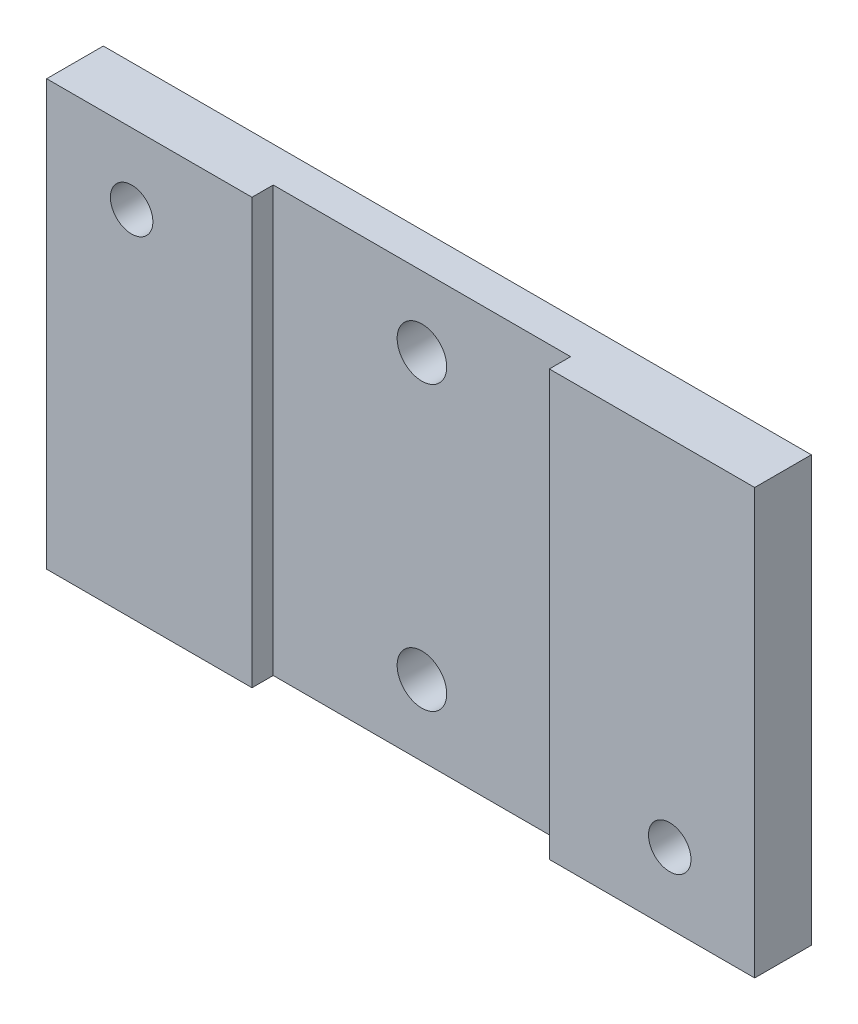
ISO-10303-21;
HEADER;
FILE_DESCRIPTION(('STEP AP214'),'2;1');
FILE_NAME('part.step','',(''),(''),'','','');
FILE_SCHEMA(('AUTOMOTIVE_DESIGN { 1 0 10303 214 1 1 1 1 }'));
ENDSEC;
DATA;
#1=APPLICATION_CONTEXT('core data for automotive mechanical design processes');
#2=APPLICATION_PROTOCOL_DEFINITION('international standard','automotive_design',2000,#1);
#3=PRODUCT_CONTEXT('',#1,'mechanical');
#4=PRODUCT('Part','Part','',(#3));
#5=PRODUCT_RELATED_PRODUCT_CATEGORY('part','',(#4));
#6=PRODUCT_DEFINITION_FORMATION('','',#4);
#7=PRODUCT_DEFINITION_CONTEXT('part definition',#1,'design');
#8=PRODUCT_DEFINITION('design','',#6,#7);
#9=PRODUCT_DEFINITION_SHAPE('','',#8);
#10=(LENGTH_UNIT() NAMED_UNIT(*) SI_UNIT(.MILLI.,.METRE.));
#11=(NAMED_UNIT(*) PLANE_ANGLE_UNIT() SI_UNIT($,.RADIAN.));
#12=(NAMED_UNIT(*) SI_UNIT($,.STERADIAN.) SOLID_ANGLE_UNIT());
#13=UNCERTAINTY_MEASURE_WITH_UNIT(LENGTH_MEASURE(1.E-05),#10,'distance_accuracy_value','');
#14=(GEOMETRIC_REPRESENTATION_CONTEXT(3) GLOBAL_UNCERTAINTY_ASSIGNED_CONTEXT((#13)) GLOBAL_UNIT_ASSIGNED_CONTEXT((#10,
#11,#12)) REPRESENTATION_CONTEXT('',''));
#15=CARTESIAN_POINT('',(0.,0.,0.));
#16=DIRECTION('',(0.,0.,1.));
#17=DIRECTION('',(1.,0.,0.));
#18=AXIS2_PLACEMENT_3D('',#15,#16,#17);
#19=CARTESIAN_POINT('',(0.,0.,4.));
#20=DIRECTION('',(0.,0.,-1.));
#21=DIRECTION('',(-1.,0.,0.));
#22=AXIS2_PLACEMENT_3D('',#19,#20,#21);
#23=PLANE('',#22);
#24=CARTESIAN_POINT('',(6.,25.,4.));
#25=DIRECTION('',(0.,0.,1.));
#26=DIRECTION('',(1.,0.,0.));
#27=AXIS2_PLACEMENT_3D('',#24,#25,#26);
#28=CIRCLE('',#27,1.5);
#29=CARTESIAN_POINT('',(7.5,25.,4.));
#30=VERTEX_POINT('',#29);
#31=EDGE_CURVE('E153',#30,#30,#28,.T.);
#32=ORIENTED_EDGE('',*,*,#31,.F.);
#33=EDGE_LOOP('',(#32));
#34=FACE_BOUND('',#33,.T.);
#35=DIRECTION('',(1.,0.,0.));
#36=VECTOR('',#35,1.);
#37=CARTESIAN_POINT('',(0.,0.,4.));
#38=LINE('',#37,#36);
#39=CARTESIAN_POINT('',(0.,0.,4.));
#40=VERTEX_POINT('',#39);
#41=CARTESIAN_POINT('',(14.5,0.,4.));
#42=VERTEX_POINT('',#41);
#43=EDGE_CURVE('E92',#40,#42,#38,.T.);
#44=ORIENTED_EDGE('',*,*,#43,.T.);
#45=DIRECTION('',(0.,-1.,0.));
#46=VECTOR('',#45,1.);
#47=CARTESIAN_POINT('',(14.5,30.,4.));
#48=LINE('',#47,#46);
#49=CARTESIAN_POINT('',(14.5,30.,4.));
#50=VERTEX_POINT('',#49);
#51=EDGE_CURVE('E118',#50,#42,#48,.T.);
#52=ORIENTED_EDGE('',*,*,#51,.F.);
#53=DIRECTION('',(-1.,0.,0.));
#54=VECTOR('',#53,1.);
#55=CARTESIAN_POINT('',(0.,30.,4.));
#56=LINE('',#55,#54);
#57=CARTESIAN_POINT('',(0.,30.,4.));
#58=VERTEX_POINT('',#57);
#59=EDGE_CURVE('E63',#50,#58,#56,.T.);
#60=ORIENTED_EDGE('',*,*,#59,.T.);
#61=DIRECTION('',(0.,-1.,0.));
#62=VECTOR('',#61,1.);
#63=CARTESIAN_POINT('',(0.,0.,4.));
#64=LINE('',#63,#62);
#65=EDGE_CURVE('E159',#58,#40,#64,.T.);
#66=ORIENTED_EDGE('',*,*,#65,.T.);
#67=EDGE_LOOP('',(#44,#52,#60,#66));
#68=FACE_BOUND('',#67,.T.);
#69=ADVANCED_FACE('F39',(#34,#68),#23,.F.);
#70=CARTESIAN_POINT('',(50.,30.,4.));
#71=VERTEX_POINT('',#70);
#72=CARTESIAN_POINT('',(35.5,30.,4.));
#73=VERTEX_POINT('',#72);
#74=EDGE_CURVE('E165',#71,#73,#56,.T.);
#75=ORIENTED_EDGE('',*,*,#74,.T.);
#76=DIRECTION('',(0.,1.,0.));
#77=VECTOR('',#76,1.);
#78=CARTESIAN_POINT('',(35.5,30.,4.));
#79=LINE('',#78,#77);
#80=CARTESIAN_POINT('',(35.5,0.,4.));
#81=VERTEX_POINT('',#80);
#82=EDGE_CURVE('E128',#81,#73,#79,.T.);
#83=ORIENTED_EDGE('',*,*,#82,.F.);
#84=CARTESIAN_POINT('',(50.,0.,4.));
#85=VERTEX_POINT('',#84);
#86=EDGE_CURVE('E161',#81,#85,#38,.T.);
#87=ORIENTED_EDGE('',*,*,#86,.T.);
#88=DIRECTION('',(0.,1.,0.));
#89=VECTOR('',#88,1.);
#90=CARTESIAN_POINT('',(50.,0.,4.));
#91=LINE('',#90,#89);
#92=EDGE_CURVE('E163',#85,#71,#91,.T.);
#93=ORIENTED_EDGE('',*,*,#92,.T.);
#94=EDGE_LOOP('',(#75,#83,#87,#93));
#95=FACE_BOUND('',#94,.T.);
#96=CARTESIAN_POINT('',(44.,5.,4.));
#97=DIRECTION('',(0.,0.,1.));
#98=DIRECTION('',(1.,0.,0.));
#99=AXIS2_PLACEMENT_3D('',#96,#97,#98);
#100=CIRCLE('',#99,1.5);
#101=CARTESIAN_POINT('',(45.5,5.,4.));
#102=VERTEX_POINT('',#101);
#103=EDGE_CURVE('E147',#102,#102,#100,.T.);
#104=ORIENTED_EDGE('',*,*,#103,.F.);
#105=EDGE_LOOP('',(#104));
#106=FACE_BOUND('',#105,.T.);
#107=ADVANCED_FACE('F194',(#95,#106),#23,.F.);
#108=CARTESIAN_POINT('',(0.,0.,0.));
#109=DIRECTION('',(0.,0.,-1.));
#110=DIRECTION('',(-1.,0.,0.));
#111=AXIS2_PLACEMENT_3D('',#108,#109,#110);
#112=PLANE('',#111);
#113=CARTESIAN_POINT('',(25.,25.,0.));
#114=DIRECTION('',(0.,0.,-1.));
#115=DIRECTION('',(-1.,0.,0.));
#116=AXIS2_PLACEMENT_3D('',#113,#114,#115);
#117=CIRCLE('',#116,1.75);
#118=CARTESIAN_POINT('',(23.25,25.,0.));
#119=VERTEX_POINT('',#118);
#120=EDGE_CURVE('E138',#119,#119,#117,.T.);
#121=ORIENTED_EDGE('',*,*,#120,.F.);
#122=EDGE_LOOP('',(#121));
#123=FACE_BOUND('',#122,.T.);
#124=CARTESIAN_POINT('',(25.,5.,0.));
#125=DIRECTION('',(0.,0.,-1.));
#126=DIRECTION('',(-1.,0.,0.));
#127=AXIS2_PLACEMENT_3D('',#124,#125,#126);
#128=CIRCLE('',#127,1.75);
#129=CARTESIAN_POINT('',(23.25,5.,0.));
#130=VERTEX_POINT('',#129);
#131=EDGE_CURVE('E301',#130,#130,#128,.T.);
#132=ORIENTED_EDGE('',*,*,#131,.F.);
#133=EDGE_LOOP('',(#132));
#134=FACE_BOUND('',#133,.T.);
#135=CARTESIAN_POINT('',(6.,25.,0.));
#136=DIRECTION('',(0.,0.,1.));
#137=DIRECTION('',(1.,0.,0.));
#138=AXIS2_PLACEMENT_3D('',#135,#136,#137);
#139=CIRCLE('',#138,1.5);
#140=CARTESIAN_POINT('',(7.5,25.,0.));
#141=VERTEX_POINT('',#140);
#142=EDGE_CURVE('E150',#141,#141,#139,.T.);
#143=ORIENTED_EDGE('',*,*,#142,.T.);
#144=EDGE_LOOP('',(#143));
#145=FACE_BOUND('',#144,.T.);
#146=DIRECTION('',(0.,-1.,0.));
#147=VECTOR('',#146,1.);
#148=CARTESIAN_POINT('',(0.,0.,0.));
#149=LINE('',#148,#147);
#150=CARTESIAN_POINT('',(0.,30.,0.));
#151=VERTEX_POINT('',#150);
#152=CARTESIAN_POINT('',(0.,0.,0.));
#153=VERTEX_POINT('',#152);
#154=EDGE_CURVE('E156',#151,#153,#149,.T.);
#155=ORIENTED_EDGE('',*,*,#154,.F.);
#156=DIRECTION('',(-1.,0.,0.));
#157=VECTOR('',#156,1.);
#158=CARTESIAN_POINT('',(0.,30.,0.));
#159=LINE('',#158,#157);
#160=CARTESIAN_POINT('',(50.,30.,0.));
#161=VERTEX_POINT('',#160);
#162=EDGE_CURVE('E85',#161,#151,#159,.T.);
#163=ORIENTED_EDGE('',*,*,#162,.F.);
#164=DIRECTION('',(0.,1.,0.));
#165=VECTOR('',#164,1.);
#166=CARTESIAN_POINT('',(50.,0.,0.));
#167=LINE('',#166,#165);
#168=CARTESIAN_POINT('',(50.,0.,0.));
#169=VERTEX_POINT('',#168);
#170=EDGE_CURVE('E173',#169,#161,#167,.T.);
#171=ORIENTED_EDGE('',*,*,#170,.F.);
#172=DIRECTION('',(1.,0.,0.));
#173=VECTOR('',#172,1.);
#174=CARTESIAN_POINT('',(0.,0.,0.));
#175=LINE('',#174,#173);
#176=EDGE_CURVE('E171',#153,#169,#175,.T.);
#177=ORIENTED_EDGE('',*,*,#176,.F.);
#178=EDGE_LOOP('',(#155,#163,#171,#177));
#179=FACE_BOUND('',#178,.T.);
#180=CARTESIAN_POINT('',(44.,5.,0.));
#181=DIRECTION('',(0.,0.,1.));
#182=DIRECTION('',(1.,0.,0.));
#183=AXIS2_PLACEMENT_3D('',#180,#181,#182);
#184=CIRCLE('',#183,1.5);
#185=CARTESIAN_POINT('',(45.5,5.,0.));
#186=VERTEX_POINT('',#185);
#187=EDGE_CURVE('E142',#186,#186,#184,.T.);
#188=ORIENTED_EDGE('',*,*,#187,.T.);
#189=EDGE_LOOP('',(#188));
#190=FACE_BOUND('',#189,.T.);
#191=ADVANCED_FACE('F187',(#123,#134,#145,#179,#190),#112,.T.);
#192=CARTESIAN_POINT('',(0.,0.,4.));
#193=DIRECTION('',(1.,0.,0.));
#194=DIRECTION('',(0.,0.,-1.));
#195=AXIS2_PLACEMENT_3D('',#192,#193,#194);
#196=PLANE('',#195);
#197=ORIENTED_EDGE('',*,*,#154,.T.);
#198=DIRECTION('',(0.,0.,-1.));
#199=VECTOR('',#198,1.);
#200=CARTESIAN_POINT('',(0.,0.,4.));
#201=LINE('',#200,#199);
#202=EDGE_CURVE('E11',#40,#153,#201,.T.);
#203=ORIENTED_EDGE('',*,*,#202,.F.);
#204=ORIENTED_EDGE('',*,*,#65,.F.);
#205=DIRECTION('',(0.,0.,-1.));
#206=VECTOR('',#205,1.);
#207=CARTESIAN_POINT('',(0.,30.,4.));
#208=LINE('',#207,#206);
#209=EDGE_CURVE('E168',#58,#151,#208,.T.);
#210=ORIENTED_EDGE('',*,*,#209,.T.);
#211=EDGE_LOOP('',(#197,#203,#204,#210));
#212=FACE_BOUND('',#211,.T.);
#213=ADVANCED_FACE('F41',(#212),#196,.F.);
#214=CARTESIAN_POINT('',(0.,0.,4.));
#215=DIRECTION('',(0.,1.,0.));
#216=DIRECTION('',(0.,0.,1.));
#217=AXIS2_PLACEMENT_3D('',#214,#215,#216);
#218=PLANE('',#217);
#219=DIRECTION('',(1.,0.,0.));
#220=VECTOR('',#219,1.);
#221=CARTESIAN_POINT('',(14.5,0.,2.5));
#222=LINE('',#221,#220);
#223=CARTESIAN_POINT('',(14.5,0.,2.5));
#224=VERTEX_POINT('',#223);
#225=CARTESIAN_POINT('',(35.5,0.,2.5));
#226=VERTEX_POINT('',#225);
#227=EDGE_CURVE('E124',#224,#226,#222,.T.);
#228=ORIENTED_EDGE('',*,*,#227,.F.);
#229=DIRECTION('',(0.,0.,1.));
#230=VECTOR('',#229,1.);
#231=CARTESIAN_POINT('',(14.5,0.,2.5));
#232=LINE('',#231,#230);
#233=EDGE_CURVE('E114',#224,#42,#232,.T.);
#234=ORIENTED_EDGE('',*,*,#233,.T.);
#235=ORIENTED_EDGE('',*,*,#43,.F.);
#236=ORIENTED_EDGE('',*,*,#202,.T.);
#237=ORIENTED_EDGE('',*,*,#176,.T.);
#238=DIRECTION('',(0.,0.,-1.));
#239=VECTOR('',#238,1.);
#240=CARTESIAN_POINT('',(50.,0.,4.));
#241=LINE('',#240,#239);
#242=EDGE_CURVE('E47',#85,#169,#241,.T.);
#243=ORIENTED_EDGE('',*,*,#242,.F.);
#244=ORIENTED_EDGE('',*,*,#86,.F.);
#245=DIRECTION('',(0.,0.,1.));
#246=VECTOR('',#245,1.);
#247=CARTESIAN_POINT('',(35.5,0.,2.5));
#248=LINE('',#247,#246);
#249=EDGE_CURVE('E120',#226,#81,#248,.T.);
#250=ORIENTED_EDGE('',*,*,#249,.F.);
#251=EDGE_LOOP('',(#228,#234,#235,#236,#237,#243,#244,#250));
#252=FACE_BOUND('',#251,.T.);
#253=ADVANCED_FACE('F130',(#252),#218,.F.);
#254=CARTESIAN_POINT('',(50.,0.,4.));
#255=DIRECTION('',(-1.,0.,0.));
#256=DIRECTION('',(0.,0.,1.));
#257=AXIS2_PLACEMENT_3D('',#254,#255,#256);
#258=PLANE('',#257);
#259=ORIENTED_EDGE('',*,*,#170,.T.);
#260=DIRECTION('',(0.,0.,-1.));
#261=VECTOR('',#260,1.);
#262=CARTESIAN_POINT('',(50.,30.,4.));
#263=LINE('',#262,#261);
#264=EDGE_CURVE('E177',#71,#161,#263,.T.);
#265=ORIENTED_EDGE('',*,*,#264,.F.);
#266=ORIENTED_EDGE('',*,*,#92,.F.);
#267=ORIENTED_EDGE('',*,*,#242,.T.);
#268=EDGE_LOOP('',(#259,#265,#266,#267));
#269=FACE_BOUND('',#268,.T.);
#270=ADVANCED_FACE('F183',(#269),#258,.F.);
#271=CARTESIAN_POINT('',(0.,30.,4.));
#272=DIRECTION('',(0.,-1.,0.));
#273=DIRECTION('',(0.,0.,-1.));
#274=AXIS2_PLACEMENT_3D('',#271,#272,#273);
#275=PLANE('',#274);
#276=ORIENTED_EDGE('',*,*,#59,.F.);
#277=DIRECTION('',(0.,0.,1.));
#278=VECTOR('',#277,1.);
#279=CARTESIAN_POINT('',(14.5,30.,2.5));
#280=LINE('',#279,#278);
#281=CARTESIAN_POINT('',(14.5,30.,2.5));
#282=VERTEX_POINT('',#281);
#283=EDGE_CURVE('E140',#282,#50,#280,.T.);
#284=ORIENTED_EDGE('',*,*,#283,.F.);
#285=DIRECTION('',(-1.,0.,0.));
#286=VECTOR('',#285,1.);
#287=CARTESIAN_POINT('',(14.5,30.,2.5));
#288=LINE('',#287,#286);
#289=CARTESIAN_POINT('',(35.5,30.,2.5));
#290=VERTEX_POINT('',#289);
#291=EDGE_CURVE('E121',#290,#282,#288,.T.);
#292=ORIENTED_EDGE('',*,*,#291,.F.);
#293=DIRECTION('',(0.,0.,1.));
#294=VECTOR('',#293,1.);
#295=CARTESIAN_POINT('',(35.5,30.,2.5));
#296=LINE('',#295,#294);
#297=EDGE_CURVE('E143',#290,#73,#296,.T.);
#298=ORIENTED_EDGE('',*,*,#297,.T.);
#299=ORIENTED_EDGE('',*,*,#74,.F.);
#300=ORIENTED_EDGE('',*,*,#264,.T.);
#301=ORIENTED_EDGE('',*,*,#162,.T.);
#302=ORIENTED_EDGE('',*,*,#209,.F.);
#303=EDGE_LOOP('',(#276,#284,#292,#298,#299,#300,#301,#302));
#304=FACE_BOUND('',#303,.T.);
#305=ADVANCED_FACE('F192',(#304),#275,.F.);
#306=CARTESIAN_POINT('',(6.,25.,4.));
#307=DIRECTION('',(0.,0.,-1.));
#308=DIRECTION('',(-1.,0.,0.));
#309=AXIS2_PLACEMENT_3D('',#306,#307,#308);
#310=CYLINDRICAL_SURFACE('',#309,1.5);
#311=ORIENTED_EDGE('',*,*,#31,.T.);
#312=EDGE_LOOP('',(#311));
#313=FACE_BOUND('',#312,.T.);
#314=ORIENTED_EDGE('',*,*,#142,.F.);
#315=EDGE_LOOP('',(#314));
#316=FACE_BOUND('',#315,.T.);
#317=ADVANCED_FACE('F205',(#313,#316),#310,.F.);
#318=CARTESIAN_POINT('',(44.,5.,4.));
#319=DIRECTION('',(0.,0.,-1.));
#320=DIRECTION('',(-1.,0.,0.));
#321=AXIS2_PLACEMENT_3D('',#318,#319,#320);
#322=CYLINDRICAL_SURFACE('',#321,1.5);
#323=ORIENTED_EDGE('',*,*,#103,.T.);
#324=EDGE_LOOP('',(#323));
#325=FACE_BOUND('',#324,.T.);
#326=ORIENTED_EDGE('',*,*,#187,.F.);
#327=EDGE_LOOP('',(#326));
#328=FACE_BOUND('',#327,.T.);
#329=ADVANCED_FACE('F232',(#325,#328),#322,.F.);
#330=CARTESIAN_POINT('',(14.5,30.,2.5));
#331=DIRECTION('',(-1.,0.,0.));
#332=DIRECTION('',(0.,-1.,0.));
#333=AXIS2_PLACEMENT_3D('',#330,#331,#332);
#334=PLANE('',#333);
#335=ORIENTED_EDGE('',*,*,#51,.T.);
#336=ORIENTED_EDGE('',*,*,#233,.F.);
#337=DIRECTION('',(0.,-1.,0.));
#338=VECTOR('',#337,1.);
#339=CARTESIAN_POINT('',(14.5,30.,2.5));
#340=LINE('',#339,#338);
#341=EDGE_CURVE('E117',#282,#224,#340,.T.);
#342=ORIENTED_EDGE('',*,*,#341,.F.);
#343=ORIENTED_EDGE('',*,*,#283,.T.);
#344=EDGE_LOOP('',(#335,#336,#342,#343));
#345=FACE_BOUND('',#344,.T.);
#346=ADVANCED_FACE('F116',(#345),#334,.F.);
#347=CARTESIAN_POINT('',(35.5,30.,2.5));
#348=DIRECTION('',(1.,0.,0.));
#349=DIRECTION('',(0.,1.,0.));
#350=AXIS2_PLACEMENT_3D('',#347,#348,#349);
#351=PLANE('',#350);
#352=ORIENTED_EDGE('',*,*,#82,.T.);
#353=ORIENTED_EDGE('',*,*,#297,.F.);
#354=DIRECTION('',(0.,1.,0.));
#355=VECTOR('',#354,1.);
#356=CARTESIAN_POINT('',(35.5,30.,2.5));
#357=LINE('',#356,#355);
#358=EDGE_CURVE('E54',#226,#290,#357,.T.);
#359=ORIENTED_EDGE('',*,*,#358,.F.);
#360=ORIENTED_EDGE('',*,*,#249,.T.);
#361=EDGE_LOOP('',(#352,#353,#359,#360));
#362=FACE_BOUND('',#361,.T.);
#363=ADVANCED_FACE('F254',(#362),#351,.F.);
#364=CARTESIAN_POINT('',(0.,0.,2.5));
#365=DIRECTION('',(0.,0.,1.));
#366=DIRECTION('',(1.,0.,0.));
#367=AXIS2_PLACEMENT_3D('',#364,#365,#366);
#368=PLANE('',#367);
#369=CARTESIAN_POINT('',(25.,25.,2.5));
#370=DIRECTION('',(0.,0.,1.));
#371=DIRECTION('',(1.,0.,0.));
#372=AXIS2_PLACEMENT_3D('',#369,#370,#371);
#373=CIRCLE('',#372,1.75);
#374=CARTESIAN_POINT('',(26.75,25.,2.5));
#375=VERTEX_POINT('',#374);
#376=EDGE_CURVE('E300',#375,#375,#373,.T.);
#377=ORIENTED_EDGE('',*,*,#376,.F.);
#378=EDGE_LOOP('',(#377));
#379=FACE_BOUND('',#378,.T.);
#380=CARTESIAN_POINT('',(25.,5.,2.5));
#381=DIRECTION('',(0.,0.,1.));
#382=DIRECTION('',(1.,0.,0.));
#383=AXIS2_PLACEMENT_3D('',#380,#381,#382);
#384=CIRCLE('',#383,1.75);
#385=CARTESIAN_POINT('',(26.75,5.,2.5));
#386=VERTEX_POINT('',#385);
#387=EDGE_CURVE('E302',#386,#386,#384,.T.);
#388=ORIENTED_EDGE('',*,*,#387,.F.);
#389=EDGE_LOOP('',(#388));
#390=FACE_BOUND('',#389,.T.);
#391=ORIENTED_EDGE('',*,*,#341,.T.);
#392=ORIENTED_EDGE('',*,*,#227,.T.);
#393=ORIENTED_EDGE('',*,*,#358,.T.);
#394=ORIENTED_EDGE('',*,*,#291,.T.);
#395=EDGE_LOOP('',(#391,#392,#393,#394));
#396=FACE_BOUND('',#395,.T.);
#397=ADVANCED_FACE('F123',(#379,#390,#396),#368,.T.);
#398=CARTESIAN_POINT('',(25.,5.,-2.5));
#399=DIRECTION('',(0.,0.,1.));
#400=DIRECTION('',(1.,0.,0.));
#401=AXIS2_PLACEMENT_3D('',#398,#399,#400);
#402=CYLINDRICAL_SURFACE('',#401,1.75);
#403=ORIENTED_EDGE('',*,*,#131,.T.);
#404=EDGE_LOOP('',(#403));
#405=FACE_BOUND('',#404,.T.);
#406=ORIENTED_EDGE('',*,*,#387,.T.);
#407=EDGE_LOOP('',(#406));
#408=FACE_BOUND('',#407,.T.);
#409=ADVANCED_FACE('F272',(#405,#408),#402,.F.);
#410=CARTESIAN_POINT('',(25.,25.,-2.5));
#411=DIRECTION('',(0.,0.,1.));
#412=DIRECTION('',(1.,0.,0.));
#413=AXIS2_PLACEMENT_3D('',#410,#411,#412);
#414=CYLINDRICAL_SURFACE('',#413,1.75);
#415=ORIENTED_EDGE('',*,*,#120,.T.);
#416=EDGE_LOOP('',(#415));
#417=FACE_BOUND('',#416,.T.);
#418=ORIENTED_EDGE('',*,*,#376,.T.);
#419=EDGE_LOOP('',(#418));
#420=FACE_BOUND('',#419,.T.);
#421=ADVANCED_FACE('F282',(#417,#420),#414,.F.);
#422=CLOSED_SHELL('',(#69,#107,#191,#213,#253,#270,#305,#317,#329,#346,#363,#397,#409,#421));
#423=MANIFOLD_SOLID_BREP('B2',#422);
#424=ADVANCED_BREP_SHAPE_REPRESENTATION('',(#18,#423),#14);
#425=SHAPE_DEFINITION_REPRESENTATION(#9,#424);
ENDSEC;
END-ISO-10303-21;
